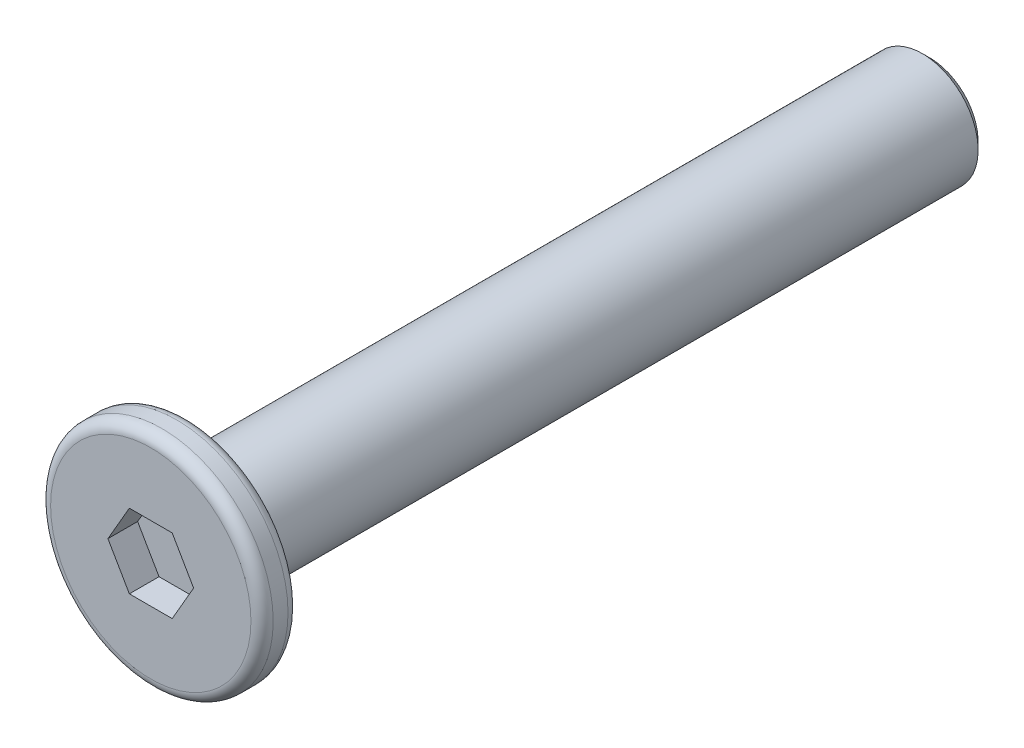
ISO-10303-21;
HEADER;
FILE_DESCRIPTION(('STEP AP214'),'2;1');
FILE_NAME('part.step','',(''),(''),'','','');
FILE_SCHEMA(('AUTOMOTIVE_DESIGN { 1 0 10303 214 1 1 1 1 }'));
ENDSEC;
DATA;
#1=APPLICATION_CONTEXT('core data for automotive mechanical design processes');
#2=APPLICATION_PROTOCOL_DEFINITION('international standard','automotive_design',2000,#1);
#3=PRODUCT_CONTEXT('',#1,'mechanical');
#4=PRODUCT('Part','Part','',(#3));
#5=PRODUCT_RELATED_PRODUCT_CATEGORY('part','',(#4));
#6=PRODUCT_DEFINITION_FORMATION('','',#4);
#7=PRODUCT_DEFINITION_CONTEXT('part definition',#1,'design');
#8=PRODUCT_DEFINITION('design','',#6,#7);
#9=PRODUCT_DEFINITION_SHAPE('','',#8);
#10=(LENGTH_UNIT() NAMED_UNIT(*) SI_UNIT(.MILLI.,.METRE.));
#11=(NAMED_UNIT(*) PLANE_ANGLE_UNIT() SI_UNIT($,.RADIAN.));
#12=(NAMED_UNIT(*) SI_UNIT($,.STERADIAN.) SOLID_ANGLE_UNIT());
#13=UNCERTAINTY_MEASURE_WITH_UNIT(LENGTH_MEASURE(1.E-05),#10,'distance_accuracy_value','');
#14=(GEOMETRIC_REPRESENTATION_CONTEXT(3) GLOBAL_UNCERTAINTY_ASSIGNED_CONTEXT((#13)) GLOBAL_UNIT_ASSIGNED_CONTEXT((#10,
#11,#12)) REPRESENTATION_CONTEXT('',''));
#15=CARTESIAN_POINT('',(0.,0.,0.));
#16=DIRECTION('',(0.,0.,1.));
#17=DIRECTION('',(1.,0.,0.));
#18=AXIS2_PLACEMENT_3D('',#15,#16,#17);
#19=CARTESIAN_POINT('',(0.,0.,0.5));
#20=DIRECTION('',(0.,0.,-1.));
#21=DIRECTION('',(-1.,0.,0.));
#22=AXIS2_PLACEMENT_3D('',#19,#20,#21);
#23=CYLINDRICAL_SURFACE('',#22,3.);
#24=CARTESIAN_POINT('',(0.,0.,-0.2));
#25=DIRECTION('',(0.,0.,1.));
#26=DIRECTION('',(1.,0.,0.));
#27=AXIS2_PLACEMENT_3D('',#24,#25,#26);
#28=CIRCLE('',#27,3.);
#29=CARTESIAN_POINT('',(3.,0.,-0.2));
#30=VERTEX_POINT('',#29);
#31=EDGE_CURVE('E154',#30,#30,#28,.T.);
#32=ORIENTED_EDGE('',*,*,#31,.T.);
#33=EDGE_LOOP('',(#32));
#34=FACE_BOUND('',#33,.T.);
#35=CARTESIAN_POINT('',(0.,0.,0.2));
#36=DIRECTION('',(0.,0.,1.));
#37=DIRECTION('',(1.,0.,0.));
#38=AXIS2_PLACEMENT_3D('',#35,#36,#37);
#39=CIRCLE('',#38,3.);
#40=CARTESIAN_POINT('',(3.,0.,0.2));
#41=VERTEX_POINT('',#40);
#42=EDGE_CURVE('E151',#41,#41,#39,.F.);
#43=ORIENTED_EDGE('',*,*,#42,.T.);
#44=EDGE_LOOP('',(#43));
#45=FACE_BOUND('',#44,.T.);
#46=ADVANCED_FACE('F35',(#34,#45),#23,.T.);
#47=CARTESIAN_POINT('',(0.,0.,0.5));
#48=DIRECTION('',(0.,0.,1.));
#49=DIRECTION('',(1.,0.,0.));
#50=AXIS2_PLACEMENT_3D('',#47,#48,#49);
#51=PLANE('',#50);
#52=CARTESIAN_POINT('',(0.,0.,0.5));
#53=DIRECTION('',(0.,0.,1.));
#54=DIRECTION('',(1.,0.,0.));
#55=AXIS2_PLACEMENT_3D('',#52,#53,#54);
#56=CIRCLE('',#55,2.7);
#57=CARTESIAN_POINT('',(2.7,0.,0.5));
#58=VERTEX_POINT('',#57);
#59=EDGE_CURVE('E11',#58,#58,#56,.T.);
#60=ORIENTED_EDGE('',*,*,#59,.T.);
#61=EDGE_LOOP('',(#60));
#62=FACE_BOUND('',#61,.T.);
#63=DIRECTION('',(0.5,0.866025403784439,0.));
#64=VECTOR('',#63,1.);
#65=CARTESIAN_POINT('',(0.577350269189626,-1.,0.5));
#66=LINE('',#65,#64);
#67=CARTESIAN_POINT('',(0.577350269189626,-1.,0.5));
#68=VERTEX_POINT('',#67);
#69=CARTESIAN_POINT('',(1.15470053837925,0.,0.5));
#70=VERTEX_POINT('',#69);
#71=EDGE_CURVE('E50',#68,#70,#66,.T.);
#72=ORIENTED_EDGE('',*,*,#71,.F.);
#73=DIRECTION('',(1.,0.,0.));
#74=VECTOR('',#73,1.);
#75=CARTESIAN_POINT('',(-0.577350269189625,-1.,0.5));
#76=LINE('',#75,#74);
#77=CARTESIAN_POINT('',(-0.577350269189625,-1.,0.5));
#78=VERTEX_POINT('',#77);
#79=EDGE_CURVE('E133',#78,#68,#76,.T.);
#80=ORIENTED_EDGE('',*,*,#79,.F.);
#81=DIRECTION('',(0.5,-0.866025403784438,0.));
#82=VECTOR('',#81,1.);
#83=CARTESIAN_POINT('',(-1.15470053837925,0.,0.5));
#84=LINE('',#83,#82);
#85=CARTESIAN_POINT('',(-1.15470053837925,0.,0.5));
#86=VERTEX_POINT('',#85);
#87=EDGE_CURVE('E131',#86,#78,#84,.T.);
#88=ORIENTED_EDGE('',*,*,#87,.F.);
#89=DIRECTION('',(-0.5,-0.866025403784438,0.));
#90=VECTOR('',#89,1.);
#91=CARTESIAN_POINT('',(-0.577350269189626,1.,0.5));
#92=LINE('',#91,#90);
#93=CARTESIAN_POINT('',(-0.577350269189626,1.,0.5));
#94=VERTEX_POINT('',#93);
#95=EDGE_CURVE('E98',#94,#86,#92,.T.);
#96=ORIENTED_EDGE('',*,*,#95,.F.);
#97=DIRECTION('',(-1.,0.,0.));
#98=VECTOR('',#97,1.);
#99=CARTESIAN_POINT('',(0.577350269189625,1.,0.5));
#100=LINE('',#99,#98);
#101=CARTESIAN_POINT('',(0.577350269189625,1.,0.5));
#102=VERTEX_POINT('',#101);
#103=EDGE_CURVE('E127',#102,#94,#100,.T.);
#104=ORIENTED_EDGE('',*,*,#103,.F.);
#105=DIRECTION('',(-0.5,0.866025403784438,0.));
#106=VECTOR('',#105,1.);
#107=CARTESIAN_POINT('',(1.15470053837925,0.,0.5));
#108=LINE('',#107,#106);
#109=EDGE_CURVE('E124',#70,#102,#108,.T.);
#110=ORIENTED_EDGE('',*,*,#109,.F.);
#111=EDGE_LOOP('',(#72,#80,#88,#96,#104,#110));
#112=FACE_BOUND('',#111,.T.);
#113=ADVANCED_FACE('F169',(#62,#112),#51,.T.);
#114=CARTESIAN_POINT('',(0.,0.,-0.5));
#115=DIRECTION('',(0.,0.,1.));
#116=DIRECTION('',(1.,0.,0.));
#117=AXIS2_PLACEMENT_3D('',#114,#115,#116);
#118=PLANE('',#117);
#119=CARTESIAN_POINT('',(0.,0.,-0.5));
#120=DIRECTION('',(0.,0.,1.));
#121=DIRECTION('',(1.,0.,0.));
#122=AXIS2_PLACEMENT_3D('',#119,#120,#121);
#123=CIRCLE('',#122,2.7);
#124=CARTESIAN_POINT('',(2.7,0.,-0.5));
#125=VERTEX_POINT('',#124);
#126=EDGE_CURVE('E43',#125,#125,#123,.F.);
#127=ORIENTED_EDGE('',*,*,#126,.T.);
#128=EDGE_LOOP('',(#127));
#129=FACE_BOUND('',#128,.T.);
#130=CARTESIAN_POINT('',(0.,0.,-0.5));
#131=DIRECTION('',(0.,0.,-1.));
#132=DIRECTION('',(-1.,0.,0.));
#133=AXIS2_PLACEMENT_3D('',#130,#131,#132);
#134=CIRCLE('',#133,1.5);
#135=CARTESIAN_POINT('',(-1.5,0.,-0.5));
#136=VERTEX_POINT('',#135);
#137=EDGE_CURVE('E137',#136,#136,#134,.T.);
#138=ORIENTED_EDGE('',*,*,#137,.F.);
#139=EDGE_LOOP('',(#138));
#140=FACE_BOUND('',#139,.T.);
#141=ADVANCED_FACE('F159',(#129,#140),#118,.F.);
#142=CARTESIAN_POINT('',(0.,0.,-20.5));
#143=DIRECTION('',(0.,0.,1.));
#144=DIRECTION('',(1.,0.,0.));
#145=AXIS2_PLACEMENT_3D('',#142,#143,#144);
#146=CYLINDRICAL_SURFACE('',#145,1.5);
#147=CARTESIAN_POINT('',(0.,0.,-20.3));
#148=DIRECTION('',(0.,0.,-1.));
#149=DIRECTION('',(-1.,0.,0.));
#150=AXIS2_PLACEMENT_3D('',#147,#148,#149);
#151=CIRCLE('',#150,1.5);
#152=CARTESIAN_POINT('',(-1.5,0.,-20.3));
#153=VERTEX_POINT('',#152);
#154=EDGE_CURVE('E148',#153,#153,#151,.F.);
#155=ORIENTED_EDGE('',*,*,#154,.T.);
#156=EDGE_LOOP('',(#155));
#157=FACE_BOUND('',#156,.T.);
#158=ORIENTED_EDGE('',*,*,#137,.T.);
#159=EDGE_LOOP('',(#158));
#160=FACE_BOUND('',#159,.T.);
#161=ADVANCED_FACE('F204',(#157,#160),#146,.T.);
#162=CARTESIAN_POINT('',(0.,0.,-20.5));
#163=DIRECTION('',(0.,0.,-1.));
#164=DIRECTION('',(-1.,0.,0.));
#165=AXIS2_PLACEMENT_3D('',#162,#163,#164);
#166=PLANE('',#165);
#167=CARTESIAN_POINT('',(0.,0.,-20.5));
#168=DIRECTION('',(0.,0.,-1.));
#169=DIRECTION('',(-1.,0.,0.));
#170=AXIS2_PLACEMENT_3D('',#167,#168,#169);
#171=CIRCLE('',#170,1.3);
#172=CARTESIAN_POINT('',(-1.3,0.,-20.5));
#173=VERTEX_POINT('',#172);
#174=EDGE_CURVE('E145',#173,#173,#171,.T.);
#175=ORIENTED_EDGE('',*,*,#174,.T.);
#176=EDGE_LOOP('',(#175));
#177=FACE_BOUND('',#176,.T.);
#178=ADVANCED_FACE('F196',(#177),#166,.T.);
#179=CARTESIAN_POINT('',(0.,0.,-20.5));
#180=DIRECTION('',(0.,0.,1.));
#181=DIRECTION('',(1.,0.,0.));
#182=AXIS2_PLACEMENT_3D('',#179,#180,#181);
#183=CONICAL_SURFACE('',#182,1.3,0.785398163397454);
#184=ORIENTED_EDGE('',*,*,#154,.F.);
#185=EDGE_LOOP('',(#184));
#186=FACE_BOUND('',#185,.T.);
#187=ORIENTED_EDGE('',*,*,#174,.F.);
#188=EDGE_LOOP('',(#187));
#189=FACE_BOUND('',#188,.T.);
#190=ADVANCED_FACE('F189',(#186,#189),#183,.T.);
#191=CARTESIAN_POINT('',(0.577350269189626,-1.,-0.3));
#192=DIRECTION('',(0.866025403784439,-0.5,0.));
#193=DIRECTION('',(0.5,0.866025403784439,0.));
#194=AXIS2_PLACEMENT_3D('',#191,#192,#193);
#195=PLANE('',#194);
#196=ORIENTED_EDGE('',*,*,#71,.T.);
#197=DIRECTION('',(0.,0.,1.));
#198=VECTOR('',#197,1.);
#199=CARTESIAN_POINT('',(1.15470053837925,0.,-0.3));
#200=LINE('',#199,#198);
#201=CARTESIAN_POINT('',(1.15470053837925,0.,-0.3));
#202=VERTEX_POINT('',#201);
#203=EDGE_CURVE('E80',#202,#70,#200,.T.);
#204=ORIENTED_EDGE('',*,*,#203,.F.);
#205=DIRECTION('',(0.5,0.866025403784439,0.));
#206=VECTOR('',#205,1.);
#207=CARTESIAN_POINT('',(0.577350269189626,-1.,-0.3));
#208=LINE('',#207,#206);
#209=CARTESIAN_POINT('',(0.577350269189626,-1.,-0.3));
#210=VERTEX_POINT('',#209);
#211=EDGE_CURVE('E135',#210,#202,#208,.T.);
#212=ORIENTED_EDGE('',*,*,#211,.F.);
#213=DIRECTION('',(0.,0.,1.));
#214=VECTOR('',#213,1.);
#215=CARTESIAN_POINT('',(0.577350269189626,-1.,-0.3));
#216=LINE('',#215,#214);
#217=EDGE_CURVE('E58',#210,#68,#216,.T.);
#218=ORIENTED_EDGE('',*,*,#217,.T.);
#219=EDGE_LOOP('',(#196,#204,#212,#218));
#220=FACE_BOUND('',#219,.T.);
#221=ADVANCED_FACE('F186',(#220),#195,.F.);
#222=CARTESIAN_POINT('',(-0.577350269189625,-1.,-0.3));
#223=DIRECTION('',(0.,-1.,0.));
#224=DIRECTION('',(1.,0.,0.));
#225=AXIS2_PLACEMENT_3D('',#222,#223,#224);
#226=PLANE('',#225);
#227=ORIENTED_EDGE('',*,*,#79,.T.);
#228=ORIENTED_EDGE('',*,*,#217,.F.);
#229=DIRECTION('',(1.,0.,0.));
#230=VECTOR('',#229,1.);
#231=CARTESIAN_POINT('',(-0.577350269189625,-1.,-0.3));
#232=LINE('',#231,#230);
#233=CARTESIAN_POINT('',(-0.577350269189625,-1.,-0.3));
#234=VERTEX_POINT('',#233);
#235=EDGE_CURVE('E110',#234,#210,#232,.T.);
#236=ORIENTED_EDGE('',*,*,#235,.F.);
#237=DIRECTION('',(0.,0.,1.));
#238=VECTOR('',#237,1.);
#239=CARTESIAN_POINT('',(-0.577350269189625,-1.,-0.3));
#240=LINE('',#239,#238);
#241=EDGE_CURVE('E102',#234,#78,#240,.T.);
#242=ORIENTED_EDGE('',*,*,#241,.T.);
#243=EDGE_LOOP('',(#227,#228,#236,#242));
#244=FACE_BOUND('',#243,.T.);
#245=ADVANCED_FACE('F188',(#244),#226,.F.);
#246=CARTESIAN_POINT('',(-1.15470053837925,0.,-0.3));
#247=DIRECTION('',(-0.866025403784438,-0.5,0.));
#248=DIRECTION('',(0.5,-0.866025403784438,0.));
#249=AXIS2_PLACEMENT_3D('',#246,#247,#248);
#250=PLANE('',#249);
#251=ORIENTED_EDGE('',*,*,#87,.T.);
#252=ORIENTED_EDGE('',*,*,#241,.F.);
#253=DIRECTION('',(0.5,-0.866025403784438,0.));
#254=VECTOR('',#253,1.);
#255=CARTESIAN_POINT('',(-1.15470053837925,0.,-0.3));
#256=LINE('',#255,#254);
#257=CARTESIAN_POINT('',(-1.15470053837925,0.,-0.3));
#258=VERTEX_POINT('',#257);
#259=EDGE_CURVE('E106',#258,#234,#256,.T.);
#260=ORIENTED_EDGE('',*,*,#259,.F.);
#261=DIRECTION('',(0.,0.,1.));
#262=VECTOR('',#261,1.);
#263=CARTESIAN_POINT('',(-1.15470053837925,0.,-0.3));
#264=LINE('',#263,#262);
#265=EDGE_CURVE('E91',#258,#86,#264,.T.);
#266=ORIENTED_EDGE('',*,*,#265,.T.);
#267=EDGE_LOOP('',(#251,#252,#260,#266));
#268=FACE_BOUND('',#267,.T.);
#269=ADVANCED_FACE('F107',(#268),#250,.F.);
#270=CARTESIAN_POINT('',(-0.577350269189626,1.,-0.3));
#271=DIRECTION('',(-0.866025403784438,0.5,0.));
#272=DIRECTION('',(-0.5,-0.866025403784439,0.));
#273=AXIS2_PLACEMENT_3D('',#270,#271,#272);
#274=PLANE('',#273);
#275=ORIENTED_EDGE('',*,*,#95,.T.);
#276=ORIENTED_EDGE('',*,*,#265,.F.);
#277=DIRECTION('',(-0.5,-0.866025403784438,0.));
#278=VECTOR('',#277,1.);
#279=CARTESIAN_POINT('',(-0.577350269189626,1.,-0.3));
#280=LINE('',#279,#278);
#281=CARTESIAN_POINT('',(-0.577350269189626,1.,-0.3));
#282=VERTEX_POINT('',#281);
#283=EDGE_CURVE('E95',#282,#258,#280,.T.);
#284=ORIENTED_EDGE('',*,*,#283,.F.);
#285=DIRECTION('',(0.,0.,1.));
#286=VECTOR('',#285,1.);
#287=CARTESIAN_POINT('',(-0.577350269189626,1.,-0.3));
#288=LINE('',#287,#286);
#289=EDGE_CURVE('E103',#282,#94,#288,.T.);
#290=ORIENTED_EDGE('',*,*,#289,.T.);
#291=EDGE_LOOP('',(#275,#276,#284,#290));
#292=FACE_BOUND('',#291,.T.);
#293=ADVANCED_FACE('F93',(#292),#274,.F.);
#294=CARTESIAN_POINT('',(0.577350269189625,1.,-0.3));
#295=DIRECTION('',(0.,1.,0.));
#296=DIRECTION('',(0.,0.,1.));
#297=AXIS2_PLACEMENT_3D('',#294,#295,#296);
#298=PLANE('',#297);
#299=ORIENTED_EDGE('',*,*,#103,.T.);
#300=ORIENTED_EDGE('',*,*,#289,.F.);
#301=DIRECTION('',(-1.,0.,0.));
#302=VECTOR('',#301,1.);
#303=CARTESIAN_POINT('',(0.577350269189625,1.,-0.3));
#304=LINE('',#303,#302);
#305=CARTESIAN_POINT('',(0.577350269189625,1.,-0.3));
#306=VERTEX_POINT('',#305);
#307=EDGE_CURVE('E116',#306,#282,#304,.T.);
#308=ORIENTED_EDGE('',*,*,#307,.F.);
#309=DIRECTION('',(0.,0.,1.));
#310=VECTOR('',#309,1.);
#311=CARTESIAN_POINT('',(0.577350269189625,1.,-0.3));
#312=LINE('',#311,#310);
#313=EDGE_CURVE('E140',#306,#102,#312,.T.);
#314=ORIENTED_EDGE('',*,*,#313,.T.);
#315=EDGE_LOOP('',(#299,#300,#308,#314));
#316=FACE_BOUND('',#315,.T.);
#317=ADVANCED_FACE('F257',(#316),#298,.F.);
#318=CARTESIAN_POINT('',(1.15470053837925,0.,-0.3));
#319=DIRECTION('',(0.866025403784438,0.5,0.));
#320=DIRECTION('',(-0.5,0.866025403784439,0.));
#321=AXIS2_PLACEMENT_3D('',#318,#319,#320);
#322=PLANE('',#321);
#323=ORIENTED_EDGE('',*,*,#109,.T.);
#324=ORIENTED_EDGE('',*,*,#313,.F.);
#325=DIRECTION('',(-0.5,0.866025403784438,0.));
#326=VECTOR('',#325,1.);
#327=CARTESIAN_POINT('',(1.15470053837925,0.,-0.3));
#328=LINE('',#327,#326);
#329=EDGE_CURVE('E118',#202,#306,#328,.T.);
#330=ORIENTED_EDGE('',*,*,#329,.F.);
#331=ORIENTED_EDGE('',*,*,#203,.T.);
#332=EDGE_LOOP('',(#323,#324,#330,#331));
#333=FACE_BOUND('',#332,.T.);
#334=ADVANCED_FACE('F184',(#333),#322,.F.);
#335=CARTESIAN_POINT('',(0.,0.,-0.3));
#336=DIRECTION('',(0.,0.,1.));
#337=DIRECTION('',(1.,0.,0.));
#338=AXIS2_PLACEMENT_3D('',#335,#336,#337);
#339=PLANE('',#338);
#340=ORIENTED_EDGE('',*,*,#211,.T.);
#341=ORIENTED_EDGE('',*,*,#329,.T.);
#342=ORIENTED_EDGE('',*,*,#307,.T.);
#343=ORIENTED_EDGE('',*,*,#283,.T.);
#344=ORIENTED_EDGE('',*,*,#259,.T.);
#345=ORIENTED_EDGE('',*,*,#235,.T.);
#346=EDGE_LOOP('',(#340,#341,#342,#343,#344,#345));
#347=FACE_BOUND('',#346,.T.);
#348=ADVANCED_FACE('F113',(#347),#339,.T.);
#349=CARTESIAN_POINT('',(0.,0.,-0.2));
#350=DIRECTION('',(0.,0.,1.));
#351=DIRECTION('',(1.,0.,0.));
#352=AXIS2_PLACEMENT_3D('',#349,#350,#351);
#353=TOROIDAL_SURFACE('',#352,2.7,0.3);
#354=ORIENTED_EDGE('',*,*,#126,.F.);
#355=EDGE_LOOP('',(#354));
#356=FACE_BOUND('',#355,.T.);
#357=ORIENTED_EDGE('',*,*,#31,.F.);
#358=EDGE_LOOP('',(#357));
#359=FACE_BOUND('',#358,.T.);
#360=ADVANCED_FACE('F162',(#356,#359),#353,.T.);
#361=CARTESIAN_POINT('',(0.,0.,0.2));
#362=DIRECTION('',(0.,0.,1.));
#363=DIRECTION('',(1.,0.,0.));
#364=AXIS2_PLACEMENT_3D('',#361,#362,#363);
#365=TOROIDAL_SURFACE('',#364,2.7,0.3);
#366=ORIENTED_EDGE('',*,*,#42,.F.);
#367=EDGE_LOOP('',(#366));
#368=FACE_BOUND('',#367,.T.);
#369=ORIENTED_EDGE('',*,*,#59,.F.);
#370=EDGE_LOOP('',(#369));
#371=FACE_BOUND('',#370,.T.);
#372=ADVANCED_FACE('F37',(#368,#371),#365,.T.);
#373=CLOSED_SHELL('',(#46,#113,#141,#161,#178,#190,#221,#245,#269,#293,#317,#334,#348,#360,#372));
#374=MANIFOLD_SOLID_BREP('B2',#373);
#375=ADVANCED_BREP_SHAPE_REPRESENTATION('',(#18,#374),#14);
#376=SHAPE_DEFINITION_REPRESENTATION(#9,#375);
ENDSEC;
END-ISO-10303-21;
